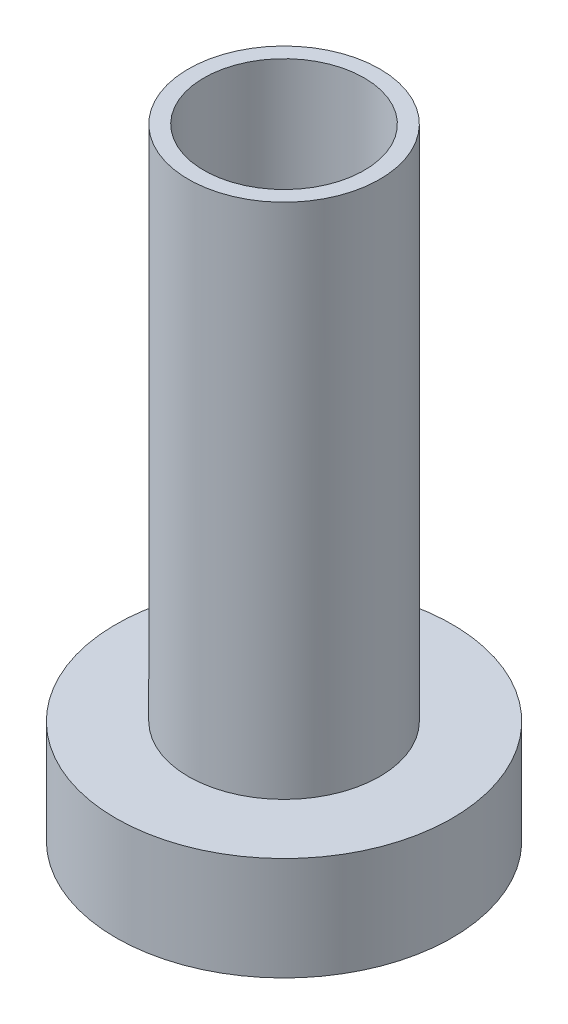
ISO-10303-21;
HEADER;
FILE_DESCRIPTION(('STEP AP214'),'2;1');
FILE_NAME('part.step','',(''),(''),'','','');
FILE_SCHEMA(('AUTOMOTIVE_DESIGN { 1 0 10303 214 1 1 1 1 }'));
ENDSEC;
DATA;
#1=APPLICATION_CONTEXT('core data for automotive mechanical design processes');
#2=APPLICATION_PROTOCOL_DEFINITION('international standard','automotive_design',2000,#1);
#3=PRODUCT_CONTEXT('',#1,'mechanical');
#4=PRODUCT('Part','Part','',(#3));
#5=PRODUCT_RELATED_PRODUCT_CATEGORY('part','',(#4));
#6=PRODUCT_DEFINITION_FORMATION('','',#4);
#7=PRODUCT_DEFINITION_CONTEXT('part definition',#1,'design');
#8=PRODUCT_DEFINITION('design','',#6,#7);
#9=PRODUCT_DEFINITION_SHAPE('','',#8);
#10=(LENGTH_UNIT() NAMED_UNIT(*) SI_UNIT(.MILLI.,.METRE.));
#11=(NAMED_UNIT(*) PLANE_ANGLE_UNIT() SI_UNIT($,.RADIAN.));
#12=(NAMED_UNIT(*) SI_UNIT($,.STERADIAN.) SOLID_ANGLE_UNIT());
#13=UNCERTAINTY_MEASURE_WITH_UNIT(LENGTH_MEASURE(1.E-05),#10,'distance_accuracy_value','');
#14=(GEOMETRIC_REPRESENTATION_CONTEXT(3) GLOBAL_UNCERTAINTY_ASSIGNED_CONTEXT((#13)) GLOBAL_UNIT_ASSIGNED_CONTEXT((#10,
#11,#12)) REPRESENTATION_CONTEXT('',''));
#15=CARTESIAN_POINT('',(0.,0.,0.));
#16=DIRECTION('',(0.,0.,1.));
#17=DIRECTION('',(1.,0.,0.));
#18=AXIS2_PLACEMENT_3D('',#15,#16,#17);
#19=CARTESIAN_POINT('',(0.,2.,0.));
#20=DIRECTION('',(0.,-1.,0.));
#21=DIRECTION('',(0.,0.,-1.));
#22=AXIS2_PLACEMENT_3D('',#19,#20,#21);
#23=CYLINDRICAL_SURFACE('',#22,3.25);
#24=CARTESIAN_POINT('',(0.,2.,0.));
#25=DIRECTION('',(0.,1.,0.));
#26=DIRECTION('',(0.,0.,1.));
#27=AXIS2_PLACEMENT_3D('',#24,#25,#26);
#28=CIRCLE('',#27,3.25);
#29=CARTESIAN_POINT('',(0.,2.,3.25));
#30=VERTEX_POINT('',#29);
#31=EDGE_CURVE('E38',#30,#30,#28,.T.);
#32=ORIENTED_EDGE('',*,*,#31,.F.);
#33=EDGE_LOOP('',(#32));
#34=FACE_BOUND('',#33,.T.);
#35=CARTESIAN_POINT('',(0.,0.,0.));
#36=DIRECTION('',(0.,1.,0.));
#37=DIRECTION('',(0.,0.,1.));
#38=AXIS2_PLACEMENT_3D('',#35,#36,#37);
#39=CIRCLE('',#38,3.25);
#40=CARTESIAN_POINT('',(0.,0.,3.25));
#41=VERTEX_POINT('',#40);
#42=EDGE_CURVE('E34',#41,#41,#39,.T.);
#43=ORIENTED_EDGE('',*,*,#42,.T.);
#44=EDGE_LOOP('',(#43));
#45=FACE_BOUND('',#44,.T.);
#46=ADVANCED_FACE('F31',(#34,#45),#23,.T.);
#47=CARTESIAN_POINT('',(0.,2.,0.));
#48=DIRECTION('',(0.,1.,0.));
#49=DIRECTION('',(0.,0.,1.));
#50=AXIS2_PLACEMENT_3D('',#47,#48,#49);
#51=PLANE('',#50);
#52=CARTESIAN_POINT('',(0.,2.,0.));
#53=DIRECTION('',(0.,1.,0.));
#54=DIRECTION('',(0.,0.,1.));
#55=AXIS2_PLACEMENT_3D('',#52,#53,#54);
#56=CIRCLE('',#55,1.85);
#57=CARTESIAN_POINT('',(0.,2.,1.85));
#58=VERTEX_POINT('',#57);
#59=EDGE_CURVE('E10',#58,#58,#56,.T.);
#60=ORIENTED_EDGE('',*,*,#59,.F.);
#61=EDGE_LOOP('',(#60));
#62=FACE_BOUND('',#61,.T.);
#63=ORIENTED_EDGE('',*,*,#31,.T.);
#64=EDGE_LOOP('',(#63));
#65=FACE_BOUND('',#64,.T.);
#66=ADVANCED_FACE('F67',(#62,#65),#51,.T.);
#67=CARTESIAN_POINT('',(0.,0.,0.));
#68=DIRECTION('',(0.,1.,0.));
#69=DIRECTION('',(0.,0.,1.));
#70=AXIS2_PLACEMENT_3D('',#67,#68,#69);
#71=PLANE('',#70);
#72=CARTESIAN_POINT('',(0.,0.,0.));
#73=DIRECTION('',(0.,-1.,0.));
#74=DIRECTION('',(0.,0.,-1.));
#75=AXIS2_PLACEMENT_3D('',#72,#73,#74);
#76=CIRCLE('',#75,1.55);
#77=CARTESIAN_POINT('',(0.,0.,-1.55));
#78=VERTEX_POINT('',#77);
#79=EDGE_CURVE('E48',#78,#78,#76,.T.);
#80=ORIENTED_EDGE('',*,*,#79,.F.);
#81=EDGE_LOOP('',(#80));
#82=FACE_BOUND('',#81,.T.);
#83=ORIENTED_EDGE('',*,*,#42,.F.);
#84=EDGE_LOOP('',(#83));
#85=FACE_BOUND('',#84,.T.);
#86=ADVANCED_FACE('F63',(#82,#85),#71,.F.);
#87=CARTESIAN_POINT('',(0.,12.,0.));
#88=DIRECTION('',(0.,-1.,0.));
#89=DIRECTION('',(0.,0.,-1.));
#90=AXIS2_PLACEMENT_3D('',#87,#88,#89);
#91=CYLINDRICAL_SURFACE('',#90,1.85);
#92=ORIENTED_EDGE('',*,*,#59,.T.);
#93=EDGE_LOOP('',(#92));
#94=FACE_BOUND('',#93,.T.);
#95=CARTESIAN_POINT('',(0.,12.,0.));
#96=DIRECTION('',(0.,-1.,0.));
#97=DIRECTION('',(0.,0.,-1.));
#98=AXIS2_PLACEMENT_3D('',#95,#96,#97);
#99=CIRCLE('',#98,1.85);
#100=CARTESIAN_POINT('',(0.,12.,-1.85));
#101=VERTEX_POINT('',#100);
#102=EDGE_CURVE('E44',#101,#101,#99,.T.);
#103=ORIENTED_EDGE('',*,*,#102,.T.);
#104=EDGE_LOOP('',(#103));
#105=FACE_BOUND('',#104,.T.);
#106=ADVANCED_FACE('F66',(#94,#105),#91,.T.);
#107=CARTESIAN_POINT('',(0.,12.,0.));
#108=DIRECTION('',(0.,-1.,0.));
#109=DIRECTION('',(0.,0.,-1.));
#110=AXIS2_PLACEMENT_3D('',#107,#108,#109);
#111=PLANE('',#110);
#112=CARTESIAN_POINT('',(0.,12.,0.));
#113=DIRECTION('',(0.,-1.,0.));
#114=DIRECTION('',(0.,0.,-1.));
#115=AXIS2_PLACEMENT_3D('',#112,#113,#114);
#116=CIRCLE('',#115,1.55);
#117=CARTESIAN_POINT('',(0.,12.,-1.55));
#118=VERTEX_POINT('',#117);
#119=EDGE_CURVE('E47',#118,#118,#116,.T.);
#120=ORIENTED_EDGE('',*,*,#119,.T.);
#121=EDGE_LOOP('',(#120));
#122=FACE_BOUND('',#121,.T.);
#123=ORIENTED_EDGE('',*,*,#102,.F.);
#124=EDGE_LOOP('',(#123));
#125=FACE_BOUND('',#124,.T.);
#126=ADVANCED_FACE('F54',(#122,#125),#111,.F.);
#127=CARTESIAN_POINT('',(0.,12.,0.));
#128=DIRECTION('',(0.,-1.,0.));
#129=DIRECTION('',(0.,0.,-1.));
#130=AXIS2_PLACEMENT_3D('',#127,#128,#129);
#131=CYLINDRICAL_SURFACE('',#130,1.55);
#132=ORIENTED_EDGE('',*,*,#119,.F.);
#133=EDGE_LOOP('',(#132));
#134=FACE_BOUND('',#133,.T.);
#135=ORIENTED_EDGE('',*,*,#79,.T.);
#136=EDGE_LOOP('',(#135));
#137=FACE_BOUND('',#136,.T.);
#138=ADVANCED_FACE('F57',(#134,#137),#131,.F.);
#139=CLOSED_SHELL('',(#46,#66,#86,#106,#126,#138));
#140=MANIFOLD_SOLID_BREP('B2',#139);
#141=ADVANCED_BREP_SHAPE_REPRESENTATION('',(#18,#140),#14);
#142=SHAPE_DEFINITION_REPRESENTATION(#9,#141);
ENDSEC;
END-ISO-10303-21;
